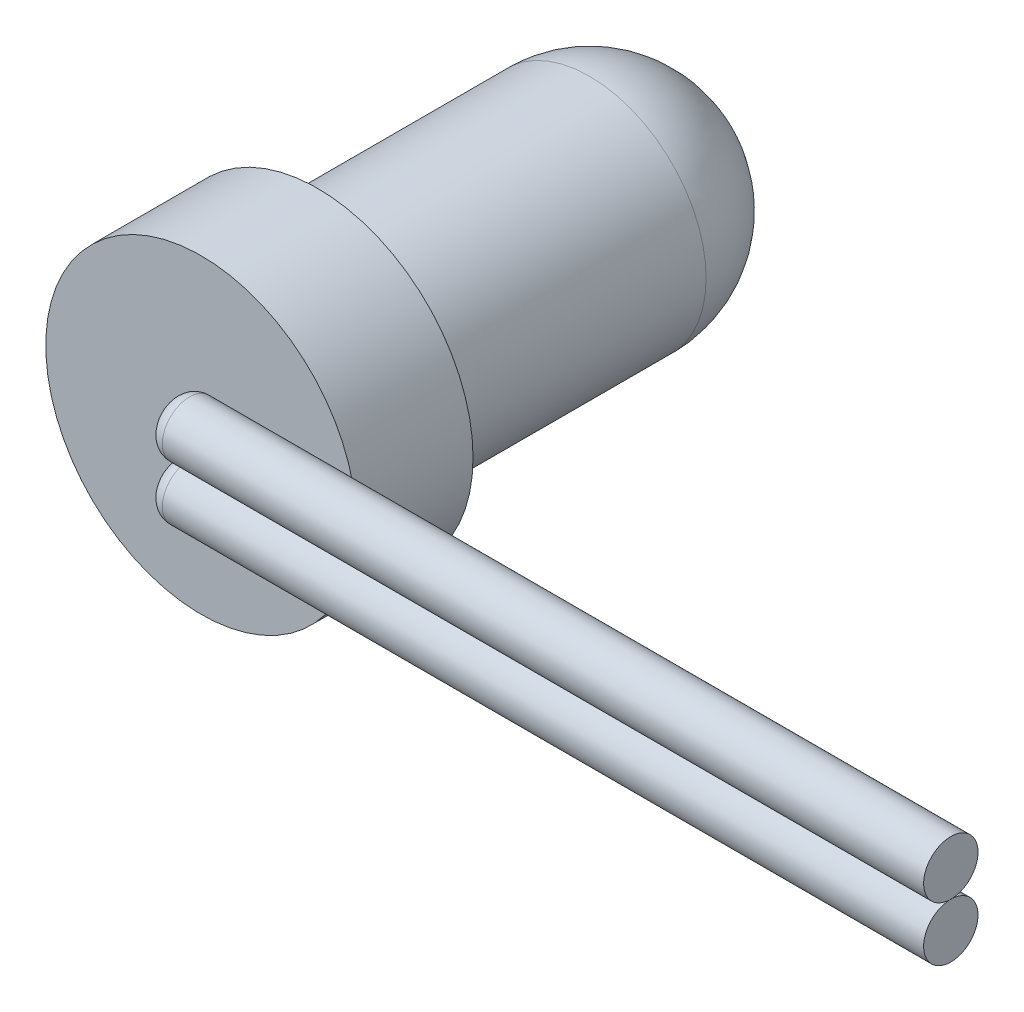
ISO-10303-21;
HEADER;
FILE_DESCRIPTION(('STEP AP214'),'2;1');
FILE_NAME('part.step','',(''),(''),'','','');
FILE_SCHEMA(('AUTOMOTIVE_DESIGN { 1 0 10303 214 1 1 1 1 }'));
ENDSEC;
DATA;
#1=APPLICATION_CONTEXT('core data for automotive mechanical design processes');
#2=APPLICATION_PROTOCOL_DEFINITION('international standard','automotive_design',2000,#1);
#3=PRODUCT_CONTEXT('',#1,'mechanical');
#4=PRODUCT('Part','Part','',(#3));
#5=PRODUCT_RELATED_PRODUCT_CATEGORY('part','',(#4));
#6=PRODUCT_DEFINITION_FORMATION('','',#4);
#7=PRODUCT_DEFINITION_CONTEXT('part definition',#1,'design');
#8=PRODUCT_DEFINITION('design','',#6,#7);
#9=PRODUCT_DEFINITION_SHAPE('','',#8);
#10=(LENGTH_UNIT() NAMED_UNIT(*) SI_UNIT(.MILLI.,.METRE.));
#11=(NAMED_UNIT(*) PLANE_ANGLE_UNIT() SI_UNIT($,.RADIAN.));
#12=(NAMED_UNIT(*) SI_UNIT($,.STERADIAN.) SOLID_ANGLE_UNIT());
#13=UNCERTAINTY_MEASURE_WITH_UNIT(LENGTH_MEASURE(1.E-05),#10,'distance_accuracy_value','');
#14=(GEOMETRIC_REPRESENTATION_CONTEXT(3) GLOBAL_UNCERTAINTY_ASSIGNED_CONTEXT((#13)) GLOBAL_UNIT_ASSIGNED_CONTEXT((#10,
#11,#12)) REPRESENTATION_CONTEXT('',''));
#15=CARTESIAN_POINT('',(0.,0.,0.));
#16=DIRECTION('',(0.,0.,1.));
#17=DIRECTION('',(1.,0.,0.));
#18=AXIS2_PLACEMENT_3D('',#15,#16,#17);
#19=CARTESIAN_POINT('',(10.,0.35,6.85));
#20=DIRECTION('',(-1.,0.,0.));
#21=DIRECTION('',(0.,0.,1.));
#22=AXIS2_PLACEMENT_3D('',#19,#20,#21);
#23=CYLINDRICAL_SURFACE('',#22,0.35);
#24=CARTESIAN_POINT('',(0.200000000000001,0.35,6.85));
#25=DIRECTION('',(1.,0.,0.));
#26=DIRECTION('',(0.,0.,-1.));
#27=AXIS2_PLACEMENT_3D('',#24,#25,#26);
#28=CIRCLE('',#27,0.35);
#29=CARTESIAN_POINT('',(0.200000000000001,0.35,6.5));
#30=VERTEX_POINT('',#29);
#31=EDGE_CURVE('E46',#30,#30,#28,.T.);
#32=ORIENTED_EDGE('',*,*,#31,.T.);
#33=EDGE_LOOP('',(#32));
#34=FACE_BOUND('',#33,.T.);
#35=CARTESIAN_POINT('',(10.,0.35,6.85));
#36=DIRECTION('',(1.,0.,0.));
#37=DIRECTION('',(0.,0.,-1.));
#38=AXIS2_PLACEMENT_3D('',#35,#36,#37);
#39=CIRCLE('',#38,0.35);
#40=CARTESIAN_POINT('',(10.,0.35,6.5));
#41=VERTEX_POINT('',#40);
#42=EDGE_CURVE('E50',#41,#41,#39,.T.);
#43=ORIENTED_EDGE('',*,*,#42,.F.);
#44=EDGE_LOOP('',(#43));
#45=FACE_BOUND('',#44,.T.);
#46=ADVANCED_FACE('F39',(#34,#45),#23,.T.);
#47=CARTESIAN_POINT('',(10.,0.,5.49110174459786));
#48=DIRECTION('',(1.,0.,0.));
#49=DIRECTION('',(0.,0.,-1.));
#50=AXIS2_PLACEMENT_3D('',#47,#48,#49);
#51=PLANE('',#50);
#52=ORIENTED_EDGE('',*,*,#42,.T.);
#53=EDGE_LOOP('',(#52));
#54=FACE_BOUND('',#53,.T.);
#55=ADVANCED_FACE('F57',(#54),#51,.T.);
#56=CARTESIAN_POINT('',(0.,0.,5.49110174459786));
#57=DIRECTION('',(1.,0.,0.));
#58=DIRECTION('',(0.,0.,-1.));
#59=AXIS2_PLACEMENT_3D('',#56,#57,#58);
#60=PLANE('',#59);
#61=CARTESIAN_POINT('',(0.,0.35,6.85));
#62=DIRECTION('',(1.,0.,0.));
#63=DIRECTION('',(0.,0.,-1.));
#64=AXIS2_PLACEMENT_3D('',#61,#62,#63);
#65=CIRCLE('',#64,0.15);
#66=CARTESIAN_POINT('',(0.,0.35,6.7));
#67=VERTEX_POINT('',#66);
#68=EDGE_CURVE('E11',#67,#67,#65,.F.);
#69=ORIENTED_EDGE('',*,*,#68,.T.);
#70=EDGE_LOOP('',(#69));
#71=FACE_BOUND('',#70,.T.);
#72=ADVANCED_FACE('F63',(#71),#60,.F.);
#73=CARTESIAN_POINT('',(0.200000000000001,0.35,6.85));
#74=DIRECTION('',(1.,0.,0.));
#75=DIRECTION('',(0.,0.,-1.));
#76=AXIS2_PLACEMENT_3D('',#73,#74,#75);
#77=DEGENERATE_TOROIDAL_SURFACE('',#76,0.15,0.2,.T.);
#78=ORIENTED_EDGE('',*,*,#68,.F.);
#79=EDGE_LOOP('',(#78));
#80=FACE_BOUND('',#79,.T.);
#81=ORIENTED_EDGE('',*,*,#31,.F.);
#82=EDGE_LOOP('',(#81));
#83=FACE_BOUND('',#82,.T.);
#84=ADVANCED_FACE('F41',(#80,#83),#77,.T.);
#85=CLOSED_SHELL('',(#46,#55,#72,#84));
#86=MANIFOLD_SOLID_BREP('B2',#85);
#87=CARTESIAN_POINT('',(10.,-0.35,6.85));
#88=DIRECTION('',(-1.,0.,0.));
#89=DIRECTION('',(0.,0.,1.));
#90=AXIS2_PLACEMENT_3D('',#87,#88,#89);
#91=CYLINDRICAL_SURFACE('',#90,0.35);
#92=CARTESIAN_POINT('',(0.200000000000001,-0.35,6.85));
#93=DIRECTION('',(1.,0.,0.));
#94=DIRECTION('',(0.,0.,-1.));
#95=AXIS2_PLACEMENT_3D('',#92,#93,#94);
#96=CIRCLE('',#95,0.35);
#97=CARTESIAN_POINT('',(0.200000000000001,-0.35,6.5));
#98=VERTEX_POINT('',#97);
#99=EDGE_CURVE('E108',#98,#98,#96,.T.);
#100=ORIENTED_EDGE('',*,*,#99,.T.);
#101=EDGE_LOOP('',(#100));
#102=FACE_BOUND('',#101,.T.);
#103=CARTESIAN_POINT('',(10.,-0.35,6.85));
#104=DIRECTION('',(1.,0.,0.));
#105=DIRECTION('',(0.,0.,-1.));
#106=AXIS2_PLACEMENT_3D('',#103,#104,#105);
#107=CIRCLE('',#106,0.35);
#108=CARTESIAN_POINT('',(10.,-0.35,6.5));
#109=VERTEX_POINT('',#108);
#110=EDGE_CURVE('E112',#109,#109,#107,.T.);
#111=ORIENTED_EDGE('',*,*,#110,.F.);
#112=EDGE_LOOP('',(#111));
#113=FACE_BOUND('',#112,.T.);
#114=ADVANCED_FACE('F101',(#102,#113),#91,.T.);
#115=CARTESIAN_POINT('',(10.,0.,5.49110174459786));
#116=DIRECTION('',(1.,0.,0.));
#117=DIRECTION('',(0.,0.,-1.));
#118=AXIS2_PLACEMENT_3D('',#115,#116,#117);
#119=PLANE('',#118);
#120=ORIENTED_EDGE('',*,*,#110,.T.);
#121=EDGE_LOOP('',(#120));
#122=FACE_BOUND('',#121,.T.);
#123=ADVANCED_FACE('F119',(#122),#119,.T.);
#124=CARTESIAN_POINT('',(0.,0.,5.49110174459786));
#125=DIRECTION('',(1.,0.,0.));
#126=DIRECTION('',(0.,0.,-1.));
#127=AXIS2_PLACEMENT_3D('',#124,#125,#126);
#128=PLANE('',#127);
#129=CARTESIAN_POINT('',(0.,-0.35,6.85));
#130=DIRECTION('',(1.,0.,0.));
#131=DIRECTION('',(0.,0.,-1.));
#132=AXIS2_PLACEMENT_3D('',#129,#130,#131);
#133=CIRCLE('',#132,0.15);
#134=CARTESIAN_POINT('',(0.,-0.35,6.7));
#135=VERTEX_POINT('',#134);
#136=EDGE_CURVE('E38',#135,#135,#133,.F.);
#137=ORIENTED_EDGE('',*,*,#136,.T.);
#138=EDGE_LOOP('',(#137));
#139=FACE_BOUND('',#138,.T.);
#140=ADVANCED_FACE('F125',(#139),#128,.F.);
#141=CARTESIAN_POINT('',(0.200000000000001,-0.35,6.85));
#142=DIRECTION('',(1.,0.,0.));
#143=DIRECTION('',(0.,0.,-1.));
#144=AXIS2_PLACEMENT_3D('',#141,#142,#143);
#145=DEGENERATE_TOROIDAL_SURFACE('',#144,0.15,0.2,.T.);
#146=ORIENTED_EDGE('',*,*,#136,.F.);
#147=EDGE_LOOP('',(#146));
#148=FACE_BOUND('',#147,.T.);
#149=ORIENTED_EDGE('',*,*,#99,.F.);
#150=EDGE_LOOP('',(#149));
#151=FACE_BOUND('',#150,.T.);
#152=ADVANCED_FACE('F103',(#148,#151),#145,.T.);
#153=CLOSED_SHELL('',(#114,#123,#140,#152));
#154=MANIFOLD_SOLID_BREP('B6',#153);
#155=CARTESIAN_POINT('',(0.,0.,5.));
#156=DIRECTION('',(0.,0.,-1.));
#157=DIRECTION('',(-1.,0.,0.));
#158=AXIS2_PLACEMENT_3D('',#155,#156,#157);
#159=CYLINDRICAL_SURFACE('',#158,1.5);
#160=CARTESIAN_POINT('',(0.,0.,1.5));
#161=DIRECTION('',(0.,0.,-1.));
#162=DIRECTION('',(-1.,0.,0.));
#163=AXIS2_PLACEMENT_3D('',#160,#161,#162);
#164=CIRCLE('',#163,1.5);
#165=CARTESIAN_POINT('',(-1.5,0.,1.5));
#166=VERTEX_POINT('',#165);
#167=EDGE_CURVE('E100',#166,#166,#164,.F.);
#168=ORIENTED_EDGE('',*,*,#167,.T.);
#169=EDGE_LOOP('',(#168));
#170=FACE_BOUND('',#169,.T.);
#171=CARTESIAN_POINT('',(0.,0.,5.));
#172=DIRECTION('',(0.,0.,1.));
#173=DIRECTION('',(1.,0.,0.));
#174=AXIS2_PLACEMENT_3D('',#171,#172,#173);
#175=CIRCLE('',#174,1.5);
#176=CARTESIAN_POINT('',(1.5,0.,5.));
#177=VERTEX_POINT('',#176);
#178=EDGE_CURVE('E163',#177,#177,#175,.T.);
#179=ORIENTED_EDGE('',*,*,#178,.F.);
#180=EDGE_LOOP('',(#179));
#181=FACE_BOUND('',#180,.T.);
#182=ADVANCED_FACE('F156',(#170,#181),#159,.T.);
#183=CARTESIAN_POINT('',(0.,0.,5.));
#184=DIRECTION('',(0.,0.,1.));
#185=DIRECTION('',(1.,0.,0.));
#186=AXIS2_PLACEMENT_3D('',#183,#184,#185);
#187=PLANE('',#186);
#188=CARTESIAN_POINT('',(0.,0.,5.));
#189=DIRECTION('',(0.,0.,1.));
#190=DIRECTION('',(1.,0.,0.));
#191=AXIS2_PLACEMENT_3D('',#188,#189,#190);
#192=CIRCLE('',#191,2.);
#193=CARTESIAN_POINT('',(2.,0.,5.));
#194=VERTEX_POINT('',#193);
#195=EDGE_CURVE('E171',#194,#194,#192,.T.);
#196=ORIENTED_EDGE('',*,*,#195,.F.);
#197=EDGE_LOOP('',(#196));
#198=FACE_BOUND('',#197,.T.);
#199=ORIENTED_EDGE('',*,*,#178,.T.);
#200=EDGE_LOOP('',(#199));
#201=FACE_BOUND('',#200,.T.);
#202=ADVANCED_FACE('F179',(#198,#201),#187,.F.);
#203=CARTESIAN_POINT('',(0.,0.,6.5));
#204=DIRECTION('',(0.,0.,-1.));
#205=DIRECTION('',(-1.,0.,0.));
#206=AXIS2_PLACEMENT_3D('',#203,#204,#205);
#207=CYLINDRICAL_SURFACE('',#206,2.);
#208=CARTESIAN_POINT('',(0.,0.,6.5));
#209=DIRECTION('',(0.,0.,1.));
#210=DIRECTION('',(1.,0.,0.));
#211=AXIS2_PLACEMENT_3D('',#208,#209,#210);
#212=CIRCLE('',#211,2.);
#213=CARTESIAN_POINT('',(2.,0.,6.5));
#214=VERTEX_POINT('',#213);
#215=EDGE_CURVE('E167',#214,#214,#212,.T.);
#216=ORIENTED_EDGE('',*,*,#215,.F.);
#217=EDGE_LOOP('',(#216));
#218=FACE_BOUND('',#217,.T.);
#219=ORIENTED_EDGE('',*,*,#195,.T.);
#220=EDGE_LOOP('',(#219));
#221=FACE_BOUND('',#220,.T.);
#222=ADVANCED_FACE('F177',(#218,#221),#207,.T.);
#223=CARTESIAN_POINT('',(0.,0.,6.5));
#224=DIRECTION('',(0.,0.,1.));
#225=DIRECTION('',(1.,0.,0.));
#226=AXIS2_PLACEMENT_3D('',#223,#224,#225);
#227=PLANE('',#226);
#228=ORIENTED_EDGE('',*,*,#215,.T.);
#229=EDGE_LOOP('',(#228));
#230=FACE_BOUND('',#229,.T.);
#231=ADVANCED_FACE('F186',(#230),#227,.T.);
#232=CARTESIAN_POINT('',(0.,0.,1.5));
#233=DIRECTION('',(0.,0.,1.));
#234=DIRECTION('',(1.,0.,0.));
#235=AXIS2_PLACEMENT_3D('',#232,#233,#234);
#236=SPHERICAL_SURFACE('',#235,1.5);
#237=ORIENTED_EDGE('',*,*,#167,.F.);
#238=EDGE_LOOP('',(#237));
#239=FACE_BOUND('',#238,.T.);
#240=ADVANCED_FACE('F158',(#239),#236,.T.);
#241=CLOSED_SHELL('',(#182,#202,#222,#231,#240));
#242=MANIFOLD_SOLID_BREP('B33',#241);
#243=ADVANCED_BREP_SHAPE_REPRESENTATION('',(#18,#86,#154,#242),#14);
#244=SHAPE_DEFINITION_REPRESENTATION(#9,#243);
ENDSEC;
END-ISO-10303-21;
